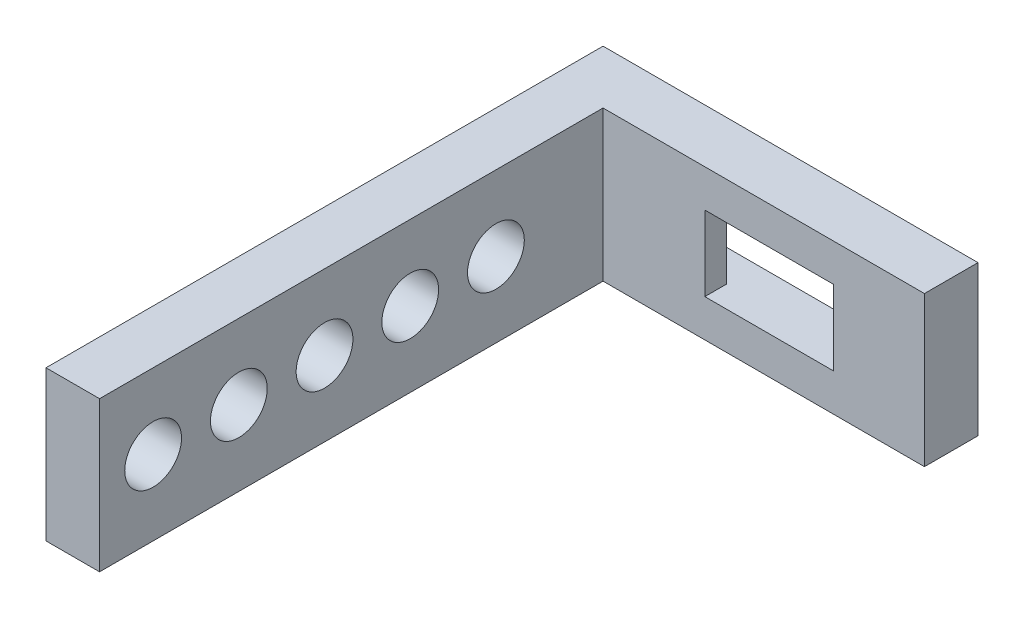
ISO-10303-21;
HEADER;
FILE_DESCRIPTION(('STEP AP214'),'2;1');
FILE_NAME('part.step','',(''),(''),'','','');
FILE_SCHEMA(('AUTOMOTIVE_DESIGN { 1 0 10303 214 1 1 1 1 }'));
ENDSEC;
DATA;
#1=APPLICATION_CONTEXT('core data for automotive mechanical design processes');
#2=APPLICATION_PROTOCOL_DEFINITION('international standard','automotive_design',2000,#1);
#3=PRODUCT_CONTEXT('',#1,'mechanical');
#4=PRODUCT('Part','Part','',(#3));
#5=PRODUCT_RELATED_PRODUCT_CATEGORY('part','',(#4));
#6=PRODUCT_DEFINITION_FORMATION('','',#4);
#7=PRODUCT_DEFINITION_CONTEXT('part definition',#1,'design');
#8=PRODUCT_DEFINITION('design','',#6,#7);
#9=PRODUCT_DEFINITION_SHAPE('','',#8);
#10=(LENGTH_UNIT() NAMED_UNIT(*) SI_UNIT(.MILLI.,.METRE.));
#11=(NAMED_UNIT(*) PLANE_ANGLE_UNIT() SI_UNIT($,.RADIAN.));
#12=(NAMED_UNIT(*) SI_UNIT($,.STERADIAN.) SOLID_ANGLE_UNIT());
#13=UNCERTAINTY_MEASURE_WITH_UNIT(LENGTH_MEASURE(1.E-05),#10,'distance_accuracy_value','');
#14=(GEOMETRIC_REPRESENTATION_CONTEXT(3) GLOBAL_UNCERTAINTY_ASSIGNED_CONTEXT((#13)) GLOBAL_UNIT_ASSIGNED_CONTEXT((#10,
#11,#12)) REPRESENTATION_CONTEXT('',''));
#15=CARTESIAN_POINT('',(0.,0.,0.));
#16=DIRECTION('',(0.,0.,1.));
#17=DIRECTION('',(1.,0.,0.));
#18=AXIS2_PLACEMENT_3D('',#15,#16,#17);
#19=CARTESIAN_POINT('',(0.,0.,-6.));
#20=DIRECTION('',(0.,0.,1.));
#21=DIRECTION('',(1.,0.,0.));
#22=AXIS2_PLACEMENT_3D('',#19,#20,#21);
#23=PLANE('',#22);
#24=DIRECTION('',(0.,-1.,0.));
#25=VECTOR('',#24,1.);
#26=CARTESIAN_POINT('',(26.5,10.5,-6.));
#27=LINE('',#26,#25);
#28=CARTESIAN_POINT('',(26.5,10.5,-6.));
#29=VERTEX_POINT('',#28);
#30=CARTESIAN_POINT('',(26.5,3.5,-6.));
#31=VERTEX_POINT('',#30);
#32=EDGE_CURVE('E307',#29,#31,#27,.T.);
#33=ORIENTED_EDGE('',*,*,#32,.F.);
#34=DIRECTION('',(1.,0.,0.));
#35=VECTOR('',#34,1.);
#36=CARTESIAN_POINT('',(8.,10.5,-6.));
#37=LINE('',#36,#35);
#38=CARTESIAN_POINT('',(33.,10.5,-6.));
#39=VERTEX_POINT('',#38);
#40=EDGE_CURVE('E286',#29,#39,#37,.T.);
#41=ORIENTED_EDGE('',*,*,#40,.T.);
#42=DIRECTION('',(0.,-1.,0.));
#43=VECTOR('',#42,1.);
#44=CARTESIAN_POINT('',(33.,10.5,-6.));
#45=LINE('',#44,#43);
#46=CARTESIAN_POINT('',(33.,3.5,-6.));
#47=VERTEX_POINT('',#46);
#48=EDGE_CURVE('E278',#39,#47,#45,.T.);
#49=ORIENTED_EDGE('',*,*,#48,.T.);
#50=DIRECTION('',(-1.,0.,0.));
#51=VECTOR('',#50,1.);
#52=CARTESIAN_POINT('',(8.,3.5,-6.));
#53=LINE('',#52,#51);
#54=EDGE_CURVE('E249',#47,#31,#53,.T.);
#55=ORIENTED_EDGE('',*,*,#54,.T.);
#56=EDGE_LOOP('',(#33,#41,#49,#55));
#57=FACE_BOUND('',#56,.T.);
#58=ADVANCED_FACE('F39',(#57),#23,.F.);
#59=DIRECTION('',(0.,1.,0.));
#60=VECTOR('',#59,1.);
#61=CARTESIAN_POINT('',(14.5,10.5,-6.));
#62=LINE('',#61,#60);
#63=CARTESIAN_POINT('',(14.5,3.5,-6.));
#64=VERTEX_POINT('',#63);
#65=CARTESIAN_POINT('',(14.5,10.5,-6.));
#66=VERTEX_POINT('',#65);
#67=EDGE_CURVE('E297',#64,#66,#62,.T.);
#68=ORIENTED_EDGE('',*,*,#67,.F.);
#69=CARTESIAN_POINT('',(8.,3.5,-6.));
#70=VERTEX_POINT('',#69);
#71=EDGE_CURVE('E277',#64,#70,#53,.T.);
#72=ORIENTED_EDGE('',*,*,#71,.T.);
#73=DIRECTION('',(0.,1.,0.));
#74=VECTOR('',#73,1.);
#75=CARTESIAN_POINT('',(8.,10.5,-6.));
#76=LINE('',#75,#74);
#77=CARTESIAN_POINT('',(8.,10.5,-6.));
#78=VERTEX_POINT('',#77);
#79=EDGE_CURVE('E261',#70,#78,#76,.T.);
#80=ORIENTED_EDGE('',*,*,#79,.T.);
#81=EDGE_CURVE('E282',#78,#66,#37,.T.);
#82=ORIENTED_EDGE('',*,*,#81,.T.);
#83=EDGE_LOOP('',(#68,#72,#80,#82));
#84=FACE_BOUND('',#83,.T.);
#85=ADVANCED_FACE('F330',(#84),#23,.F.);
#86=CARTESIAN_POINT('',(10.,14.,-4.));
#87=DIRECTION('',(0.,0.,-1.));
#88=DIRECTION('',(-1.,0.,0.));
#89=AXIS2_PLACEMENT_3D('',#86,#87,#88);
#90=PLANE('',#89);
#91=DIRECTION('',(-1.,0.,0.));
#92=VECTOR('',#91,1.);
#93=CARTESIAN_POINT('',(14.5,10.5,-4.));
#94=LINE('',#93,#92);
#95=CARTESIAN_POINT('',(26.5,10.5,-4.));
#96=VERTEX_POINT('',#95);
#97=CARTESIAN_POINT('',(14.5,10.5,-4.));
#98=VERTEX_POINT('',#97);
#99=EDGE_CURVE('E315',#96,#98,#94,.T.);
#100=ORIENTED_EDGE('',*,*,#99,.F.);
#101=DIRECTION('',(0.,1.,0.));
#102=VECTOR('',#101,1.);
#103=CARTESIAN_POINT('',(26.5,10.5,-4.));
#104=LINE('',#103,#102);
#105=CARTESIAN_POINT('',(26.5,3.5,-4.));
#106=VERTEX_POINT('',#105);
#107=EDGE_CURVE('E311',#106,#96,#104,.T.);
#108=ORIENTED_EDGE('',*,*,#107,.F.);
#109=DIRECTION('',(1.,0.,0.));
#110=VECTOR('',#109,1.);
#111=CARTESIAN_POINT('',(14.5,3.5,-4.));
#112=LINE('',#111,#110);
#113=CARTESIAN_POINT('',(14.5,3.5,-4.));
#114=VERTEX_POINT('',#113);
#115=EDGE_CURVE('E273',#114,#106,#112,.T.);
#116=ORIENTED_EDGE('',*,*,#115,.F.);
#117=DIRECTION('',(0.,-1.,0.));
#118=VECTOR('',#117,1.);
#119=CARTESIAN_POINT('',(14.5,10.5,-4.));
#120=LINE('',#119,#118);
#121=EDGE_CURVE('E319',#98,#114,#120,.T.);
#122=ORIENTED_EDGE('',*,*,#121,.F.);
#123=EDGE_LOOP('',(#100,#108,#116,#122));
#124=FACE_BOUND('',#123,.T.);
#125=DIRECTION('',(1.,0.,0.));
#126=VECTOR('',#125,1.);
#127=CARTESIAN_POINT('',(10.,0.,-4.));
#128=LINE('',#127,#126);
#129=CARTESIAN_POINT('',(5.,0.,-4.));
#130=VERTEX_POINT('',#129);
#131=CARTESIAN_POINT('',(35.,0.,-4.));
#132=VERTEX_POINT('',#131);
#133=EDGE_CURVE('E163',#130,#132,#128,.T.);
#134=ORIENTED_EDGE('',*,*,#133,.T.);
#135=DIRECTION('',(0.,-1.,0.));
#136=VECTOR('',#135,1.);
#137=CARTESIAN_POINT('',(35.,0.,-4.));
#138=LINE('',#137,#136);
#139=CARTESIAN_POINT('',(35.,14.,-4.));
#140=VERTEX_POINT('',#139);
#141=EDGE_CURVE('E55',#140,#132,#138,.T.);
#142=ORIENTED_EDGE('',*,*,#141,.F.);
#143=DIRECTION('',(1.,0.,0.));
#144=VECTOR('',#143,1.);
#145=CARTESIAN_POINT('',(10.,14.,-4.));
#146=LINE('',#145,#144);
#147=CARTESIAN_POINT('',(5.,14.,-4.));
#148=VERTEX_POINT('',#147);
#149=EDGE_CURVE('E167',#148,#140,#146,.T.);
#150=ORIENTED_EDGE('',*,*,#149,.F.);
#151=DIRECTION('',(0.,1.,0.));
#152=VECTOR('',#151,1.);
#153=CARTESIAN_POINT('',(5.,0.,-4.));
#154=LINE('',#153,#152);
#155=EDGE_CURVE('E210',#130,#148,#154,.T.);
#156=ORIENTED_EDGE('',*,*,#155,.F.);
#157=EDGE_LOOP('',(#134,#142,#150,#156));
#158=FACE_BOUND('',#157,.T.);
#159=ADVANCED_FACE('F41',(#124,#158),#90,.F.);
#160=CARTESIAN_POINT('',(0.,14.,-9.));
#161=DIRECTION('',(0.,0.,1.));
#162=DIRECTION('',(1.,0.,0.));
#163=AXIS2_PLACEMENT_3D('',#160,#161,#162);
#164=PLANE('',#163);
#165=DIRECTION('',(1.,0.,0.));
#166=VECTOR('',#165,1.);
#167=CARTESIAN_POINT('',(8.,10.5,-9.));
#168=LINE('',#167,#166);
#169=CARTESIAN_POINT('',(8.,10.5,-9.));
#170=VERTEX_POINT('',#169);
#171=CARTESIAN_POINT('',(33.,10.5,-9.));
#172=VERTEX_POINT('',#171);
#173=EDGE_CURVE('E266',#170,#172,#168,.T.);
#174=ORIENTED_EDGE('',*,*,#173,.F.);
#175=DIRECTION('',(0.,1.,0.));
#176=VECTOR('',#175,1.);
#177=CARTESIAN_POINT('',(8.,10.5,-9.));
#178=LINE('',#177,#176);
#179=CARTESIAN_POINT('',(8.,3.5,-9.));
#180=VERTEX_POINT('',#179);
#181=EDGE_CURVE('E270',#180,#170,#178,.T.);
#182=ORIENTED_EDGE('',*,*,#181,.F.);
#183=DIRECTION('',(-1.,0.,0.));
#184=VECTOR('',#183,1.);
#185=CARTESIAN_POINT('',(8.,3.5,-9.));
#186=LINE('',#185,#184);
#187=CARTESIAN_POINT('',(33.,3.5,-9.));
#188=VERTEX_POINT('',#187);
#189=EDGE_CURVE('E257',#188,#180,#186,.T.);
#190=ORIENTED_EDGE('',*,*,#189,.F.);
#191=DIRECTION('',(0.,-1.,0.));
#192=VECTOR('',#191,1.);
#193=CARTESIAN_POINT('',(33.,10.5,-9.));
#194=LINE('',#193,#192);
#195=EDGE_CURVE('E262',#172,#188,#194,.T.);
#196=ORIENTED_EDGE('',*,*,#195,.F.);
#197=EDGE_LOOP('',(#174,#182,#190,#196));
#198=FACE_BOUND('',#197,.T.);
#199=DIRECTION('',(-1.,0.,0.));
#200=VECTOR('',#199,1.);
#201=CARTESIAN_POINT('',(11.5890955973018,14.,-9.));
#202=LINE('',#201,#200);
#203=CARTESIAN_POINT('',(35.,14.,-9.));
#204=VERTEX_POINT('',#203);
#205=CARTESIAN_POINT('',(0.,14.,-9.));
#206=VERTEX_POINT('',#205);
#207=EDGE_CURVE('E155',#204,#206,#202,.T.);
#208=ORIENTED_EDGE('',*,*,#207,.F.);
#209=DIRECTION('',(0.,1.,0.));
#210=VECTOR('',#209,1.);
#211=CARTESIAN_POINT('',(35.,0.,-9.));
#212=LINE('',#211,#210);
#213=CARTESIAN_POINT('',(35.,0.,-9.));
#214=VERTEX_POINT('',#213);
#215=EDGE_CURVE('E142',#214,#204,#212,.T.);
#216=ORIENTED_EDGE('',*,*,#215,.F.);
#217=DIRECTION('',(-1.,0.,0.));
#218=VECTOR('',#217,1.);
#219=CARTESIAN_POINT('',(0.,0.,-9.));
#220=LINE('',#219,#218);
#221=CARTESIAN_POINT('',(0.,0.,-9.));
#222=VERTEX_POINT('',#221);
#223=EDGE_CURVE('E154',#214,#222,#220,.T.);
#224=ORIENTED_EDGE('',*,*,#223,.T.);
#225=DIRECTION('',(0.,-1.,0.));
#226=VECTOR('',#225,1.);
#227=CARTESIAN_POINT('',(0.,14.,-9.));
#228=LINE('',#227,#226);
#229=EDGE_CURVE('E11',#206,#222,#228,.T.);
#230=ORIENTED_EDGE('',*,*,#229,.F.);
#231=EDGE_LOOP('',(#208,#216,#224,#230));
#232=FACE_BOUND('',#231,.T.);
#233=ADVANCED_FACE('F152',(#198,#232),#164,.F.);
#234=CARTESIAN_POINT('',(0.,14.,0.));
#235=DIRECTION('',(1.,0.,0.));
#236=DIRECTION('',(0.,0.,-1.));
#237=AXIS2_PLACEMENT_3D('',#234,#235,#236);
#238=PLANE('',#237);
#239=CARTESIAN_POINT('',(0.,6.99999999999999,6.00000000000001));
#240=DIRECTION('',(-1.,0.,0.));
#241=DIRECTION('',(0.,0.,1.));
#242=AXIS2_PLACEMENT_3D('',#239,#240,#241);
#243=CIRCLE('',#242,2.65);
#244=CARTESIAN_POINT('',(0.,6.99999999999999,8.65000000000001));
#245=VERTEX_POINT('',#244);
#246=EDGE_CURVE('E190',#245,#245,#243,.T.);
#247=ORIENTED_EDGE('',*,*,#246,.F.);
#248=EDGE_LOOP('',(#247));
#249=FACE_BOUND('',#248,.T.);
#250=CARTESIAN_POINT('',(0.,6.99999999999999,14.));
#251=DIRECTION('',(-1.,0.,0.));
#252=DIRECTION('',(0.,0.,1.));
#253=AXIS2_PLACEMENT_3D('',#250,#251,#252);
#254=CIRCLE('',#253,2.65);
#255=CARTESIAN_POINT('',(0.,6.99999999999999,16.65));
#256=VERTEX_POINT('',#255);
#257=EDGE_CURVE('E227',#256,#256,#254,.T.);
#258=ORIENTED_EDGE('',*,*,#257,.F.);
#259=EDGE_LOOP('',(#258));
#260=FACE_BOUND('',#259,.T.);
#261=CARTESIAN_POINT('',(0.,6.99999999999999,22.));
#262=DIRECTION('',(-1.,0.,0.));
#263=DIRECTION('',(0.,0.,1.));
#264=AXIS2_PLACEMENT_3D('',#261,#262,#263);
#265=CIRCLE('',#264,2.65);
#266=CARTESIAN_POINT('',(0.,6.99999999999999,24.65));
#267=VERTEX_POINT('',#266);
#268=EDGE_CURVE('E219',#267,#267,#265,.T.);
#269=ORIENTED_EDGE('',*,*,#268,.F.);
#270=EDGE_LOOP('',(#269));
#271=FACE_BOUND('',#270,.T.);
#272=CARTESIAN_POINT('',(0.,6.99999999999999,30.));
#273=DIRECTION('',(-1.,0.,0.));
#274=DIRECTION('',(0.,0.,1.));
#275=AXIS2_PLACEMENT_3D('',#272,#273,#274);
#276=CIRCLE('',#275,2.65);
#277=CARTESIAN_POINT('',(0.,6.99999999999999,32.65));
#278=VERTEX_POINT('',#277);
#279=EDGE_CURVE('E211',#278,#278,#276,.T.);
#280=ORIENTED_EDGE('',*,*,#279,.F.);
#281=EDGE_LOOP('',(#280));
#282=FACE_BOUND('',#281,.T.);
#283=CARTESIAN_POINT('',(0.,6.99999999999999,38.));
#284=DIRECTION('',(-1.,0.,0.));
#285=DIRECTION('',(0.,0.,1.));
#286=AXIS2_PLACEMENT_3D('',#283,#284,#285);
#287=CIRCLE('',#286,2.65);
#288=CARTESIAN_POINT('',(0.,6.99999999999999,40.65));
#289=VERTEX_POINT('',#288);
#290=EDGE_CURVE('E201',#289,#289,#287,.T.);
#291=ORIENTED_EDGE('',*,*,#290,.F.);
#292=EDGE_LOOP('',(#291));
#293=FACE_BOUND('',#292,.T.);
#294=DIRECTION('',(0.,0.,1.));
#295=VECTOR('',#294,1.);
#296=CARTESIAN_POINT('',(0.,0.,0.));
#297=LINE('',#296,#295);
#298=CARTESIAN_POINT('',(0.,0.,43.));
#299=VERTEX_POINT('',#298);
#300=EDGE_CURVE('E161',#222,#299,#297,.T.);
#301=ORIENTED_EDGE('',*,*,#300,.T.);
#302=DIRECTION('',(0.,1.,0.));
#303=VECTOR('',#302,1.);
#304=CARTESIAN_POINT('',(0.,0.,43.));
#305=LINE('',#304,#303);
#306=CARTESIAN_POINT('',(0.,14.,43.));
#307=VERTEX_POINT('',#306);
#308=EDGE_CURVE('E185',#299,#307,#305,.T.);
#309=ORIENTED_EDGE('',*,*,#308,.T.);
#310=DIRECTION('',(0.,0.,1.));
#311=VECTOR('',#310,1.);
#312=CARTESIAN_POINT('',(0.,14.,0.));
#313=LINE('',#312,#311);
#314=EDGE_CURVE('E48',#206,#307,#313,.T.);
#315=ORIENTED_EDGE('',*,*,#314,.F.);
#316=ORIENTED_EDGE('',*,*,#229,.T.);
#317=EDGE_LOOP('',(#301,#309,#315,#316));
#318=FACE_BOUND('',#317,.T.);
#319=ADVANCED_FACE('F404',(#249,#260,#271,#282,#293,#318),#238,.F.);
#320=CARTESIAN_POINT('',(0.,14.,0.));
#321=DIRECTION('',(0.,-1.,0.));
#322=DIRECTION('',(0.,0.,-1.));
#323=AXIS2_PLACEMENT_3D('',#320,#321,#322);
#324=PLANE('',#323);
#325=ORIENTED_EDGE('',*,*,#149,.T.);
#326=DIRECTION('',(0.,0.,-1.));
#327=VECTOR('',#326,1.);
#328=CARTESIAN_POINT('',(35.,14.,43.001));
#329=LINE('',#328,#327);
#330=EDGE_CURVE('E148',#140,#204,#329,.T.);
#331=ORIENTED_EDGE('',*,*,#330,.T.);
#332=ORIENTED_EDGE('',*,*,#207,.T.);
#333=ORIENTED_EDGE('',*,*,#314,.T.);
#334=DIRECTION('',(-1.,0.,0.));
#335=VECTOR('',#334,1.);
#336=CARTESIAN_POINT('',(5.,14.,43.));
#337=LINE('',#336,#335);
#338=CARTESIAN_POINT('',(5.,14.,43.));
#339=VERTEX_POINT('',#338);
#340=EDGE_CURVE('E168',#339,#307,#337,.T.);
#341=ORIENTED_EDGE('',*,*,#340,.F.);
#342=DIRECTION('',(0.,0.,-1.));
#343=VECTOR('',#342,1.);
#344=CARTESIAN_POINT('',(5.,14.,0.));
#345=LINE('',#344,#343);
#346=EDGE_CURVE('E181',#339,#148,#345,.T.);
#347=ORIENTED_EDGE('',*,*,#346,.T.);
#348=EDGE_LOOP('',(#325,#331,#332,#333,#341,#347));
#349=FACE_BOUND('',#348,.T.);
#350=ADVANCED_FACE('F401',(#349),#324,.F.);
#351=CARTESIAN_POINT('',(0.,0.,0.));
#352=DIRECTION('',(0.,-1.,0.));
#353=DIRECTION('',(0.,0.,-1.));
#354=AXIS2_PLACEMENT_3D('',#351,#352,#353);
#355=PLANE('',#354);
#356=DIRECTION('',(0.,0.,-1.));
#357=VECTOR('',#356,1.);
#358=CARTESIAN_POINT('',(35.,0.,43.001));
#359=LINE('',#358,#357);
#360=EDGE_CURVE('E139',#132,#214,#359,.T.);
#361=ORIENTED_EDGE('',*,*,#360,.F.);
#362=ORIENTED_EDGE('',*,*,#133,.F.);
#363=DIRECTION('',(0.,0.,1.));
#364=VECTOR('',#363,1.);
#365=CARTESIAN_POINT('',(5.,0.,0.));
#366=LINE('',#365,#364);
#367=CARTESIAN_POINT('',(5.,0.,43.));
#368=VERTEX_POINT('',#367);
#369=EDGE_CURVE('E189',#130,#368,#366,.T.);
#370=ORIENTED_EDGE('',*,*,#369,.T.);
#371=DIRECTION('',(-1.,0.,0.));
#372=VECTOR('',#371,1.);
#373=CARTESIAN_POINT('',(5.,0.,43.));
#374=LINE('',#373,#372);
#375=EDGE_CURVE('E178',#368,#299,#374,.T.);
#376=ORIENTED_EDGE('',*,*,#375,.T.);
#377=ORIENTED_EDGE('',*,*,#300,.F.);
#378=ORIENTED_EDGE('',*,*,#223,.F.);
#379=EDGE_LOOP('',(#361,#362,#370,#376,#377,#378));
#380=FACE_BOUND('',#379,.T.);
#381=ADVANCED_FACE('F159',(#380),#355,.T.);
#382=CARTESIAN_POINT('',(5.,0.,43.));
#383=DIRECTION('',(0.,0.,1.));
#384=DIRECTION('',(1.,0.,0.));
#385=AXIS2_PLACEMENT_3D('',#382,#383,#384);
#386=PLANE('',#385);
#387=ORIENTED_EDGE('',*,*,#308,.F.);
#388=ORIENTED_EDGE('',*,*,#375,.F.);
#389=DIRECTION('',(0.,1.,0.));
#390=VECTOR('',#389,1.);
#391=CARTESIAN_POINT('',(5.,0.,43.));
#392=LINE('',#391,#390);
#393=EDGE_CURVE('E194',#368,#339,#392,.T.);
#394=ORIENTED_EDGE('',*,*,#393,.T.);
#395=ORIENTED_EDGE('',*,*,#340,.T.);
#396=EDGE_LOOP('',(#387,#388,#394,#395));
#397=FACE_BOUND('',#396,.T.);
#398=ADVANCED_FACE('F396',(#397),#386,.T.);
#399=CARTESIAN_POINT('',(5.,0.,0.));
#400=DIRECTION('',(1.,0.,0.));
#401=DIRECTION('',(0.,0.,-1.));
#402=AXIS2_PLACEMENT_3D('',#399,#400,#401);
#403=PLANE('',#402);
#404=ORIENTED_EDGE('',*,*,#155,.T.);
#405=ORIENTED_EDGE('',*,*,#346,.F.);
#406=ORIENTED_EDGE('',*,*,#393,.F.);
#407=ORIENTED_EDGE('',*,*,#369,.F.);
#408=EDGE_LOOP('',(#404,#405,#406,#407));
#409=FACE_BOUND('',#408,.T.);
#410=CARTESIAN_POINT('',(5.,6.99999999999999,6.00000000000001));
#411=DIRECTION('',(1.,0.,0.));
#412=DIRECTION('',(0.,0.,-1.));
#413=AXIS2_PLACEMENT_3D('',#410,#411,#412);
#414=CIRCLE('',#413,2.65);
#415=CARTESIAN_POINT('',(5.,6.99999999999999,3.35));
#416=VERTEX_POINT('',#415);
#417=EDGE_CURVE('E231',#416,#416,#414,.F.);
#418=ORIENTED_EDGE('',*,*,#417,.T.);
#419=EDGE_LOOP('',(#418));
#420=FACE_BOUND('',#419,.T.);
#421=CARTESIAN_POINT('',(5.,6.99999999999999,14.));
#422=DIRECTION('',(1.,0.,0.));
#423=DIRECTION('',(0.,0.,-1.));
#424=AXIS2_PLACEMENT_3D('',#421,#422,#423);
#425=CIRCLE('',#424,2.65);
#426=CARTESIAN_POINT('',(5.,6.99999999999999,11.35));
#427=VERTEX_POINT('',#426);
#428=EDGE_CURVE('E223',#427,#427,#425,.F.);
#429=ORIENTED_EDGE('',*,*,#428,.T.);
#430=EDGE_LOOP('',(#429));
#431=FACE_BOUND('',#430,.T.);
#432=CARTESIAN_POINT('',(5.,6.99999999999999,22.));
#433=DIRECTION('',(1.,0.,0.));
#434=DIRECTION('',(0.,0.,-1.));
#435=AXIS2_PLACEMENT_3D('',#432,#433,#434);
#436=CIRCLE('',#435,2.65);
#437=CARTESIAN_POINT('',(5.,6.99999999999999,19.35));
#438=VERTEX_POINT('',#437);
#439=EDGE_CURVE('E215',#438,#438,#436,.F.);
#440=ORIENTED_EDGE('',*,*,#439,.T.);
#441=EDGE_LOOP('',(#440));
#442=FACE_BOUND('',#441,.T.);
#443=CARTESIAN_POINT('',(5.,6.99999999999999,30.));
#444=DIRECTION('',(1.,0.,0.));
#445=DIRECTION('',(0.,0.,-1.));
#446=AXIS2_PLACEMENT_3D('',#443,#444,#445);
#447=CIRCLE('',#446,2.65);
#448=CARTESIAN_POINT('',(5.,6.99999999999999,27.35));
#449=VERTEX_POINT('',#448);
#450=EDGE_CURVE('E205',#449,#449,#447,.F.);
#451=ORIENTED_EDGE('',*,*,#450,.T.);
#452=EDGE_LOOP('',(#451));
#453=FACE_BOUND('',#452,.T.);
#454=CARTESIAN_POINT('',(5.,6.99999999999999,38.));
#455=DIRECTION('',(1.,0.,0.));
#456=DIRECTION('',(0.,0.,-1.));
#457=AXIS2_PLACEMENT_3D('',#454,#455,#456);
#458=CIRCLE('',#457,2.65);
#459=CARTESIAN_POINT('',(5.,6.99999999999999,35.35));
#460=VERTEX_POINT('',#459);
#461=EDGE_CURVE('E206',#460,#460,#458,.F.);
#462=ORIENTED_EDGE('',*,*,#461,.T.);
#463=EDGE_LOOP('',(#462));
#464=FACE_BOUND('',#463,.T.);
#465=ADVANCED_FACE('F392',(#409,#420,#431,#442,#453,#464),#403,.T.);
#466=CARTESIAN_POINT('',(12.4953318805774,6.99999999999999,38.));
#467=DIRECTION('',(-1.,0.,0.));
#468=DIRECTION('',(0.,0.,1.));
#469=AXIS2_PLACEMENT_3D('',#466,#467,#468);
#470=CYLINDRICAL_SURFACE('',#469,2.65);
#471=ORIENTED_EDGE('',*,*,#290,.T.);
#472=EDGE_LOOP('',(#471));
#473=FACE_BOUND('',#472,.T.);
#474=ORIENTED_EDGE('',*,*,#461,.F.);
#475=EDGE_LOOP('',(#474));
#476=FACE_BOUND('',#475,.T.);
#477=ADVANCED_FACE('F388',(#473,#476),#470,.F.);
#478=CARTESIAN_POINT('',(12.4953318805774,6.99999999999999,30.));
#479=DIRECTION('',(-1.,0.,0.));
#480=DIRECTION('',(0.,0.,1.));
#481=AXIS2_PLACEMENT_3D('',#478,#479,#480);
#482=CYLINDRICAL_SURFACE('',#481,2.65);
#483=ORIENTED_EDGE('',*,*,#279,.T.);
#484=EDGE_LOOP('',(#483));
#485=FACE_BOUND('',#484,.T.);
#486=ORIENTED_EDGE('',*,*,#450,.F.);
#487=EDGE_LOOP('',(#486));
#488=FACE_BOUND('',#487,.T.);
#489=ADVANCED_FACE('F384',(#485,#488),#482,.F.);
#490=CARTESIAN_POINT('',(12.4953318805774,6.99999999999999,22.));
#491=DIRECTION('',(-1.,0.,0.));
#492=DIRECTION('',(0.,0.,1.));
#493=AXIS2_PLACEMENT_3D('',#490,#491,#492);
#494=CYLINDRICAL_SURFACE('',#493,2.65);
#495=ORIENTED_EDGE('',*,*,#268,.T.);
#496=EDGE_LOOP('',(#495));
#497=FACE_BOUND('',#496,.T.);
#498=ORIENTED_EDGE('',*,*,#439,.F.);
#499=EDGE_LOOP('',(#498));
#500=FACE_BOUND('',#499,.T.);
#501=ADVANCED_FACE('F380',(#497,#500),#494,.F.);
#502=CARTESIAN_POINT('',(12.4953318805774,6.99999999999999,14.));
#503=DIRECTION('',(-1.,0.,0.));
#504=DIRECTION('',(0.,0.,1.));
#505=AXIS2_PLACEMENT_3D('',#502,#503,#504);
#506=CYLINDRICAL_SURFACE('',#505,2.65);
#507=ORIENTED_EDGE('',*,*,#257,.T.);
#508=EDGE_LOOP('',(#507));
#509=FACE_BOUND('',#508,.T.);
#510=ORIENTED_EDGE('',*,*,#428,.F.);
#511=EDGE_LOOP('',(#510));
#512=FACE_BOUND('',#511,.T.);
#513=ADVANCED_FACE('F376',(#509,#512),#506,.F.);
#514=CARTESIAN_POINT('',(12.4953318805774,6.99999999999999,6.00000000000001));
#515=DIRECTION('',(-1.,0.,0.));
#516=DIRECTION('',(0.,0.,1.));
#517=AXIS2_PLACEMENT_3D('',#514,#515,#516);
#518=CYLINDRICAL_SURFACE('',#517,2.65);
#519=ORIENTED_EDGE('',*,*,#246,.T.);
#520=EDGE_LOOP('',(#519));
#521=FACE_BOUND('',#520,.T.);
#522=ORIENTED_EDGE('',*,*,#417,.F.);
#523=EDGE_LOOP('',(#522));
#524=FACE_BOUND('',#523,.T.);
#525=ADVANCED_FACE('F373',(#521,#524),#518,.F.);
#526=CARTESIAN_POINT('',(8.,10.5,-6.));
#527=DIRECTION('',(-1.,0.,0.));
#528=DIRECTION('',(0.,0.,1.));
#529=AXIS2_PLACEMENT_3D('',#526,#527,#528);
#530=PLANE('',#529);
#531=ORIENTED_EDGE('',*,*,#181,.T.);
#532=DIRECTION('',(0.,0.,-1.));
#533=VECTOR('',#532,1.);
#534=CARTESIAN_POINT('',(8.,10.5,-6.));
#535=LINE('',#534,#533);
#536=EDGE_CURVE('E244',#78,#170,#535,.T.);
#537=ORIENTED_EDGE('',*,*,#536,.F.);
#538=ORIENTED_EDGE('',*,*,#79,.F.);
#539=DIRECTION('',(0.,0.,-1.));
#540=VECTOR('',#539,1.);
#541=CARTESIAN_POINT('',(8.,3.5,-6.));
#542=LINE('',#541,#540);
#543=EDGE_CURVE('E243',#70,#180,#542,.T.);
#544=ORIENTED_EDGE('',*,*,#543,.T.);
#545=EDGE_LOOP('',(#531,#537,#538,#544));
#546=FACE_BOUND('',#545,.T.);
#547=ADVANCED_FACE('F337',(#546),#530,.F.);
#548=CARTESIAN_POINT('',(8.,3.5,-6.));
#549=DIRECTION('',(0.,-1.,0.));
#550=DIRECTION('',(1.,0.,0.));
#551=AXIS2_PLACEMENT_3D('',#548,#549,#550);
#552=PLANE('',#551);
#553=ORIENTED_EDGE('',*,*,#189,.T.);
#554=ORIENTED_EDGE('',*,*,#543,.F.);
#555=ORIENTED_EDGE('',*,*,#71,.F.);
#556=DIRECTION('',(0.,0.,-1.));
#557=VECTOR('',#556,1.);
#558=CARTESIAN_POINT('',(14.5,3.5,43.001));
#559=LINE('',#558,#557);
#560=EDGE_CURVE('E63',#114,#64,#559,.T.);
#561=ORIENTED_EDGE('',*,*,#560,.F.);
#562=ORIENTED_EDGE('',*,*,#115,.T.);
#563=DIRECTION('',(0.,0.,-1.));
#564=VECTOR('',#563,1.);
#565=CARTESIAN_POINT('',(26.5,3.5,43.001));
#566=LINE('',#565,#564);
#567=EDGE_CURVE('E294',#106,#31,#566,.T.);
#568=ORIENTED_EDGE('',*,*,#567,.T.);
#569=ORIENTED_EDGE('',*,*,#54,.F.);
#570=DIRECTION('',(0.,0.,-1.));
#571=VECTOR('',#570,1.);
#572=CARTESIAN_POINT('',(33.,3.5,-6.));
#573=LINE('',#572,#571);
#574=EDGE_CURVE('E252',#47,#188,#573,.T.);
#575=ORIENTED_EDGE('',*,*,#574,.T.);
#576=EDGE_LOOP('',(#553,#554,#555,#561,#562,#568,#569,#575));
#577=FACE_BOUND('',#576,.T.);
#578=ADVANCED_FACE('F333',(#577),#552,.F.);
#579=CARTESIAN_POINT('',(33.,10.5,-6.));
#580=DIRECTION('',(1.,0.,0.));
#581=DIRECTION('',(0.,0.,-1.));
#582=AXIS2_PLACEMENT_3D('',#579,#580,#581);
#583=PLANE('',#582);
#584=ORIENTED_EDGE('',*,*,#195,.T.);
#585=ORIENTED_EDGE('',*,*,#574,.F.);
#586=ORIENTED_EDGE('',*,*,#48,.F.);
#587=DIRECTION('',(0.,0.,-1.));
#588=VECTOR('',#587,1.);
#589=CARTESIAN_POINT('',(33.,10.5,-6.));
#590=LINE('',#589,#588);
#591=EDGE_CURVE('E248',#39,#172,#590,.T.);
#592=ORIENTED_EDGE('',*,*,#591,.T.);
#593=EDGE_LOOP('',(#584,#585,#586,#592));
#594=FACE_BOUND('',#593,.T.);
#595=ADVANCED_FACE('F365',(#594),#583,.F.);
#596=CARTESIAN_POINT('',(8.,10.5,-6.));
#597=DIRECTION('',(0.,1.,0.));
#598=DIRECTION('',(-1.,0.,0.));
#599=AXIS2_PLACEMENT_3D('',#596,#597,#598);
#600=PLANE('',#599);
#601=ORIENTED_EDGE('',*,*,#173,.T.);
#602=ORIENTED_EDGE('',*,*,#591,.F.);
#603=ORIENTED_EDGE('',*,*,#40,.F.);
#604=DIRECTION('',(0.,0.,-1.));
#605=VECTOR('',#604,1.);
#606=CARTESIAN_POINT('',(26.5,10.5,43.001));
#607=LINE('',#606,#605);
#608=EDGE_CURVE('E293',#96,#29,#607,.T.);
#609=ORIENTED_EDGE('',*,*,#608,.F.);
#610=ORIENTED_EDGE('',*,*,#99,.T.);
#611=DIRECTION('',(0.,0.,-1.));
#612=VECTOR('',#611,1.);
#613=CARTESIAN_POINT('',(14.5,10.5,43.001));
#614=LINE('',#613,#612);
#615=EDGE_CURVE('E300',#98,#66,#614,.T.);
#616=ORIENTED_EDGE('',*,*,#615,.T.);
#617=ORIENTED_EDGE('',*,*,#81,.F.);
#618=ORIENTED_EDGE('',*,*,#536,.T.);
#619=EDGE_LOOP('',(#601,#602,#603,#609,#610,#616,#617,#618));
#620=FACE_BOUND('',#619,.T.);
#621=ADVANCED_FACE('F341',(#620),#600,.F.);
#622=CARTESIAN_POINT('',(26.5,10.5,43.001));
#623=DIRECTION('',(1.,0.,0.));
#624=DIRECTION('',(0.,0.,-1.));
#625=AXIS2_PLACEMENT_3D('',#622,#623,#624);
#626=PLANE('',#625);
#627=ORIENTED_EDGE('',*,*,#107,.T.);
#628=ORIENTED_EDGE('',*,*,#608,.T.);
#629=ORIENTED_EDGE('',*,*,#32,.T.);
#630=ORIENTED_EDGE('',*,*,#567,.F.);
#631=EDGE_LOOP('',(#627,#628,#629,#630));
#632=FACE_BOUND('',#631,.T.);
#633=ADVANCED_FACE('F346',(#632),#626,.F.);
#634=CARTESIAN_POINT('',(14.5,10.5,43.001));
#635=DIRECTION('',(-1.,0.,0.));
#636=DIRECTION('',(0.,0.,1.));
#637=AXIS2_PLACEMENT_3D('',#634,#635,#636);
#638=PLANE('',#637);
#639=ORIENTED_EDGE('',*,*,#121,.T.);
#640=ORIENTED_EDGE('',*,*,#560,.T.);
#641=ORIENTED_EDGE('',*,*,#67,.T.);
#642=ORIENTED_EDGE('',*,*,#615,.F.);
#643=EDGE_LOOP('',(#639,#640,#641,#642));
#644=FACE_BOUND('',#643,.T.);
#645=ADVANCED_FACE('F344',(#644),#638,.F.);
#646=CARTESIAN_POINT('',(35.,0.,43.001));
#647=DIRECTION('',(-1.,0.,0.));
#648=DIRECTION('',(0.,0.,1.));
#649=AXIS2_PLACEMENT_3D('',#646,#647,#648);
#650=PLANE('',#649);
#651=ORIENTED_EDGE('',*,*,#141,.T.);
#652=ORIENTED_EDGE('',*,*,#360,.T.);
#653=ORIENTED_EDGE('',*,*,#215,.T.);
#654=ORIENTED_EDGE('',*,*,#330,.F.);
#655=EDGE_LOOP('',(#651,#652,#653,#654));
#656=FACE_BOUND('',#655,.T.);
#657=ADVANCED_FACE('F141',(#656),#650,.F.);
#658=CLOSED_SHELL('',(#58,#85,#159,#233,#319,#350,#381,#398,#465,#477,#489,#501,#513,#525,#547,
#578,#595,#621,#633,#645,#657));
#659=MANIFOLD_SOLID_BREP('B2',#658);
#660=ADVANCED_BREP_SHAPE_REPRESENTATION('',(#18,#659),#14);
#661=SHAPE_DEFINITION_REPRESENTATION(#9,#660);
ENDSEC;
END-ISO-10303-21;
